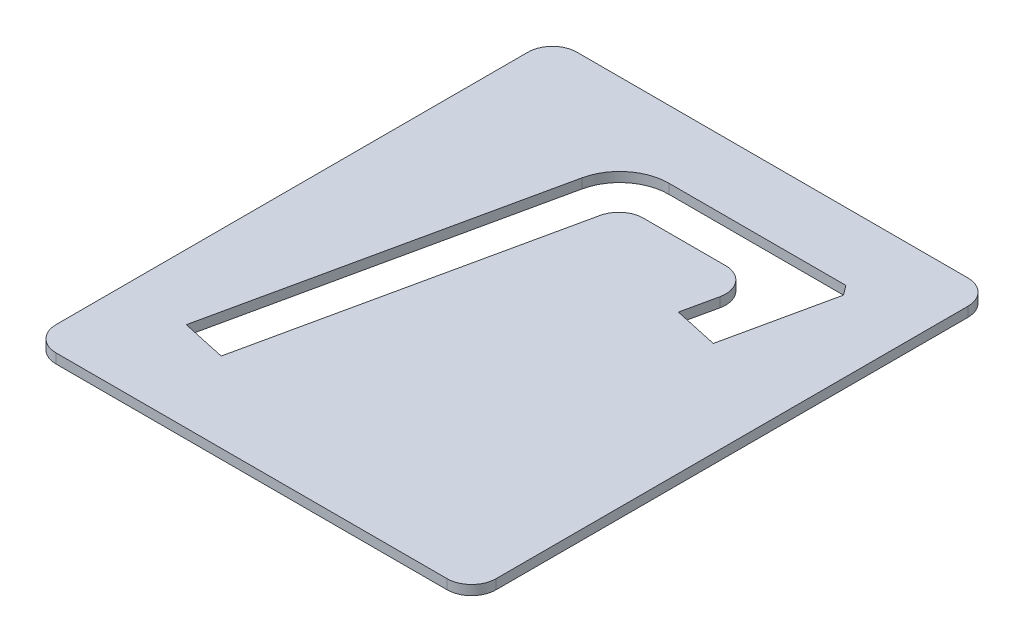
ISO-10303-21;
HEADER;
FILE_DESCRIPTION(('STEP AP214'),'2;1');
FILE_NAME('part.step','',(''),(''),'','','');
FILE_SCHEMA(('AUTOMOTIVE_DESIGN { 1 0 10303 214 1 1 1 1 }'));
ENDSEC;
DATA;
#1=APPLICATION_CONTEXT('core data for automotive mechanical design processes');
#2=APPLICATION_PROTOCOL_DEFINITION('international standard','automotive_design',2000,#1);
#3=PRODUCT_CONTEXT('',#1,'mechanical');
#4=PRODUCT('Part','Part','',(#3));
#5=PRODUCT_RELATED_PRODUCT_CATEGORY('part','',(#4));
#6=PRODUCT_DEFINITION_FORMATION('','',#4);
#7=PRODUCT_DEFINITION_CONTEXT('part definition',#1,'design');
#8=PRODUCT_DEFINITION('design','',#6,#7);
#9=PRODUCT_DEFINITION_SHAPE('','',#8);
#10=(LENGTH_UNIT() NAMED_UNIT(*) SI_UNIT(.MILLI.,.METRE.));
#11=(NAMED_UNIT(*) PLANE_ANGLE_UNIT() SI_UNIT($,.RADIAN.));
#12=(NAMED_UNIT(*) SI_UNIT($,.STERADIAN.) SOLID_ANGLE_UNIT());
#13=UNCERTAINTY_MEASURE_WITH_UNIT(LENGTH_MEASURE(1.E-05),#10,'distance_accuracy_value','');
#14=(GEOMETRIC_REPRESENTATION_CONTEXT(3) GLOBAL_UNCERTAINTY_ASSIGNED_CONTEXT((#13)) GLOBAL_UNIT_ASSIGNED_CONTEXT((#10,
#11,#12)) REPRESENTATION_CONTEXT('',''));
#15=CARTESIAN_POINT('',(0.,0.,0.));
#16=DIRECTION('',(0.,0.,1.));
#17=DIRECTION('',(1.,0.,0.));
#18=AXIS2_PLACEMENT_3D('',#15,#16,#17);
#19=CARTESIAN_POINT('',(-12.14314758519,-14.48400066,1.478172004546));
#20=DIRECTION('',(0.,1.,0.));
#21=DIRECTION('',(0.,0.,1.));
#22=AXIS2_PLACEMENT_3D('',#19,#20,#21);
#23=PLANE('',#22);
#24=DIRECTION('',(0.212429649393078,0.,-0.977176362822359));
#25=VECTOR('',#24,1.);
#26=CARTESIAN_POINT('',(-12.01390357573,-14.48400066,1.39915469259));
#27=LINE('',#26,#25);
#28=CARTESIAN_POINT('',(-12.0139035757299,-14.48400066,1.39915469258943));
#29=VERTEX_POINT('',#28);
#30=CARTESIAN_POINT('',(-11.989866506041,-14.48400066,1.28858417479478));
#31=VERTEX_POINT('',#30);
#32=EDGE_CURVE('E220',#29,#31,#27,.T.);
#33=ORIENTED_EDGE('',*,*,#32,.T.);
#34=DIRECTION('',(-0.598473967642059,0.,-0.801142253320078));
#35=VECTOR('',#34,1.);
#36=CARTESIAN_POINT('',(-11.98986650604,-14.48400066,1.288584174795));
#37=LINE('',#36,#35);
#38=CARTESIAN_POINT('',(-11.9973603129465,-14.48400066,1.2785526518309));
#39=VERTEX_POINT('',#38);
#40=EDGE_CURVE('E264',#31,#39,#37,.T.);
#41=ORIENTED_EDGE('',*,*,#40,.T.);
#42=DIRECTION('',(-1.,0.,0.));
#43=VECTOR('',#42,1.);
#44=CARTESIAN_POINT('',(-11.99736031295,-14.48400066,1.278552651833));
#45=LINE('',#44,#43);
#46=CARTESIAN_POINT('',(-12.18054455317,-14.48400066,1.278552651833));
#47=VERTEX_POINT('',#46);
#48=EDGE_CURVE('E258',#39,#47,#45,.T.);
#49=ORIENTED_EDGE('',*,*,#48,.T.);
#50=CARTESIAN_POINT('',(-12.18054455317,-14.48400066,1.329352651833));
#51=DIRECTION('',(0.,1.,0.));
#52=DIRECTION('',(0.,0.,1.));
#53=AXIS2_PLACEMENT_3D('',#50,#51,#52);
#54=CIRCLE('',#53,0.0508);
#55=CARTESIAN_POINT('',(-12.2301851124007,-14.48400066,1.31856122564392));
#56=VERTEX_POINT('',#55);
#57=EDGE_CURVE('E221',#47,#56,#54,.T.);
#58=ORIENTED_EDGE('',*,*,#57,.T.);
#59=DIRECTION('',(-0.212429649393078,0.,0.977176362822359));
#60=VECTOR('',#59,1.);
#61=CARTESIAN_POINT('',(-12.2301851124,-14.48400066,1.318561225644));
#62=LINE('',#61,#60);
#63=CARTESIAN_POINT('',(-12.3033152809703,-14.48400066,1.65495999267294));
#64=VERTEX_POINT('',#63);
#65=EDGE_CURVE('E269',#56,#64,#62,.T.);
#66=ORIENTED_EDGE('',*,*,#65,.T.);
#67=DIRECTION('',(0.977176362822359,0.,0.212429649393078));
#68=VECTOR('',#67,1.);
#69=CARTESIAN_POINT('',(-12.30331528097,-14.48400066,1.654959992673));
#70=LINE('',#69,#68);
#71=CARTESIAN_POINT('',(-12.2571702764999,-14.48400066,1.6649915156345));
#72=VERTEX_POINT('',#71);
#73=EDGE_CURVE('E275',#64,#72,#70,.T.);
#74=ORIENTED_EDGE('',*,*,#73,.T.);
#75=DIRECTION('',(0.212429649393078,0.,-0.977176362822359));
#76=VECTOR('',#75,1.);
#77=CARTESIAN_POINT('',(-12.2571702765,-14.48400066,1.664991515635));
#78=LINE('',#77,#76);
#79=CARTESIAN_POINT('',(-12.1871851567016,-14.48400066,1.34305997259639));
#80=VERTEX_POINT('',#79);
#81=EDGE_CURVE('E281',#72,#80,#78,.T.);
#82=ORIENTED_EDGE('',*,*,#81,.T.);
#83=CARTESIAN_POINT('',(-12.16236487708,-14.48400066,1.348455685692));
#84=DIRECTION('',(0.,1.,0.));
#85=DIRECTION('',(0.,0.,1.));
#86=AXIS2_PLACEMENT_3D('',#83,#84,#85);
#87=CIRCLE('',#86,0.0254);
#88=CARTESIAN_POINT('',(-12.16236487708,-14.48400066,1.323055685692));
#89=VERTEX_POINT('',#88);
#90=EDGE_CURVE('E226',#89,#80,#87,.T.);
#91=ORIENTED_EDGE('',*,*,#90,.F.);
#92=DIRECTION('',(1.,0.,0.));
#93=VECTOR('',#92,1.);
#94=CARTESIAN_POINT('',(-12.16236487708,-14.48400066,1.323055685692));
#95=LINE('',#94,#93);
#96=CARTESIAN_POINT('',(-12.07720108336,-14.48400066,1.323055685692));
#97=VERTEX_POINT('',#96);
#98=EDGE_CURVE('E229',#89,#97,#95,.T.);
#99=ORIENTED_EDGE('',*,*,#98,.T.);
#100=CARTESIAN_POINT('',(-12.07720108336,-14.48400066,1.348455685692));
#101=DIRECTION('',(0.,1.,0.));
#102=DIRECTION('',(0.,0.,1.));
#103=AXIS2_PLACEMENT_3D('',#100,#101,#102);
#104=CIRCLE('',#103,0.0254);
#105=CARTESIAN_POINT('',(-12.0523808037422,-14.48400066,1.35385139878629));
#106=VERTEX_POINT('',#105);
#107=EDGE_CURVE('E230',#106,#97,#104,.T.);
#108=ORIENTED_EDGE('',*,*,#107,.F.);
#109=DIRECTION('',(-0.212429649393078,0.,0.977176362822359));
#110=VECTOR('',#109,1.);
#111=CARTESIAN_POINT('',(-12.05238080374,-14.48400066,1.353851398786));
#112=LINE('',#111,#110);
#113=CARTESIAN_POINT('',(-12.0600485802007,-14.48400066,1.38912316962684));
#114=VERTEX_POINT('',#113);
#115=EDGE_CURVE('E233',#106,#114,#112,.T.);
#116=ORIENTED_EDGE('',*,*,#115,.T.);
#117=DIRECTION('',(0.977176362822359,0.,0.212429649393078));
#118=VECTOR('',#117,1.);
#119=CARTESIAN_POINT('',(-12.0600485802,-14.48400066,1.389123169627));
#120=LINE('',#119,#118);
#121=EDGE_CURVE('E248',#114,#29,#120,.T.);
#122=ORIENTED_EDGE('',*,*,#121,.T.);
#123=EDGE_LOOP('',(#33,#41,#49,#58,#66,#74,#82,#91,#99,#108,#116,#122));
#124=FACE_BOUND('',#123,.T.);
#125=DIRECTION('',(1.,0.,0.));
#126=VECTOR('',#125,1.);
#127=CARTESIAN_POINT('',(-12.34536886475,-14.48400066,1.747601269081));
#128=LINE('',#127,#126);
#129=CARTESIAN_POINT('',(-12.34536886475,-14.48400066,1.747601269081));
#130=VERTEX_POINT('',#129);
#131=CARTESIAN_POINT('',(-11.94092630563,-14.48400066,1.747601269081));
#132=VERTEX_POINT('',#131);
#133=EDGE_CURVE('E153',#130,#132,#128,.T.);
#134=ORIENTED_EDGE('',*,*,#133,.F.);
#135=CARTESIAN_POINT('',(-12.34536886475,-14.48400066,1.722201269081));
#136=DIRECTION('',(0.,1.,0.));
#137=DIRECTION('',(0.,0.,1.));
#138=AXIS2_PLACEMENT_3D('',#135,#136,#137);
#139=CIRCLE('',#138,0.0254);
#140=CARTESIAN_POINT('',(-12.37076886475,-14.48400066,1.722201269081));
#141=VERTEX_POINT('',#140);
#142=EDGE_CURVE('E174',#141,#130,#139,.T.);
#143=ORIENTED_EDGE('',*,*,#142,.F.);
#144=DIRECTION('',(0.,0.,1.));
#145=VECTOR('',#144,1.);
#146=CARTESIAN_POINT('',(-12.37076886475,-14.48400066,1.234142740011));
#147=LINE('',#146,#145);
#148=CARTESIAN_POINT('',(-12.37076886475,-14.48400066,1.234142740011));
#149=VERTEX_POINT('',#148);
#150=EDGE_CURVE('E180',#149,#141,#147,.T.);
#151=ORIENTED_EDGE('',*,*,#150,.F.);
#152=CARTESIAN_POINT('',(-12.34536886475,-14.48400066,1.234142740011));
#153=DIRECTION('',(0.,1.,0.));
#154=DIRECTION('',(0.,0.,1.));
#155=AXIS2_PLACEMENT_3D('',#152,#153,#154);
#156=CIRCLE('',#155,0.0254);
#157=CARTESIAN_POINT('',(-12.34536886475,-14.48400066,1.208742740011));
#158=VERTEX_POINT('',#157);
#159=EDGE_CURVE('E235',#158,#149,#156,.T.);
#160=ORIENTED_EDGE('',*,*,#159,.F.);
#161=DIRECTION('',(-1.,0.,0.));
#162=VECTOR('',#161,1.);
#163=CARTESIAN_POINT('',(-11.94092630563,-14.48400066,1.208742740011));
#164=LINE('',#163,#162);
#165=CARTESIAN_POINT('',(-11.94092630563,-14.48400066,1.208742740011));
#166=VERTEX_POINT('',#165);
#167=EDGE_CURVE('E185',#166,#158,#164,.T.);
#168=ORIENTED_EDGE('',*,*,#167,.F.);
#169=CARTESIAN_POINT('',(-11.94092630563,-14.48400066,1.234142740011));
#170=DIRECTION('',(0.,1.,0.));
#171=DIRECTION('',(0.,0.,1.));
#172=AXIS2_PLACEMENT_3D('',#169,#170,#171);
#173=CIRCLE('',#172,0.0254);
#174=CARTESIAN_POINT('',(-11.91552630563,-14.48400066,1.234142740011));
#175=VERTEX_POINT('',#174);
#176=EDGE_CURVE('E237',#175,#166,#173,.T.);
#177=ORIENTED_EDGE('',*,*,#176,.F.);
#178=DIRECTION('',(0.,0.,-1.));
#179=VECTOR('',#178,1.);
#180=CARTESIAN_POINT('',(-11.91552630563,-14.48400066,1.722201269081));
#181=LINE('',#180,#179);
#182=CARTESIAN_POINT('',(-11.91552630563,-14.48400066,1.722201269081));
#183=VERTEX_POINT('',#182);
#184=EDGE_CURVE('E156',#183,#175,#181,.T.);
#185=ORIENTED_EDGE('',*,*,#184,.F.);
#186=CARTESIAN_POINT('',(-11.94092630563,-14.48400066,1.722201269081));
#187=DIRECTION('',(0.,1.,0.));
#188=DIRECTION('',(0.,0.,1.));
#189=AXIS2_PLACEMENT_3D('',#186,#187,#188);
#190=CIRCLE('',#189,0.0254);
#191=EDGE_CURVE('E20',#132,#183,#190,.T.);
#192=ORIENTED_EDGE('',*,*,#191,.F.);
#193=EDGE_LOOP('',(#134,#143,#151,#160,#168,#177,#185,#192));
#194=FACE_BOUND('',#193,.T.);
#195=ADVANCED_FACE('F17',(#124,#194),#23,.F.);
#196=CARTESIAN_POINT('',(-11.94092630563,-14.48400066,1.722201269081));
#197=DIRECTION('',(0.,1.,0.));
#198=DIRECTION('',(0.,0.,1.));
#199=AXIS2_PLACEMENT_3D('',#196,#197,#198);
#200=CYLINDRICAL_SURFACE('',#199,0.0254);
#201=CARTESIAN_POINT('',(-11.94092630563,-14.47400066,1.722201269081));
#202=DIRECTION('',(0.,1.,0.));
#203=DIRECTION('',(0.,0.,1.));
#204=AXIS2_PLACEMENT_3D('',#201,#202,#203);
#205=CIRCLE('',#204,0.0254);
#206=CARTESIAN_POINT('',(-11.94092630563,-14.47400066,1.747601269081));
#207=VERTEX_POINT('',#206);
#208=CARTESIAN_POINT('',(-11.91552630563,-14.47400066,1.722201269081));
#209=VERTEX_POINT('',#208);
#210=EDGE_CURVE('E163',#207,#209,#205,.T.);
#211=ORIENTED_EDGE('',*,*,#210,.F.);
#212=DIRECTION('',(0.,1.,0.));
#213=VECTOR('',#212,1.);
#214=CARTESIAN_POINT('',(-11.94092630563,-14.48400066,1.747601269081));
#215=LINE('',#214,#213);
#216=EDGE_CURVE('E160',#132,#207,#215,.T.);
#217=ORIENTED_EDGE('',*,*,#216,.F.);
#218=ORIENTED_EDGE('',*,*,#191,.T.);
#219=DIRECTION('',(0.,1.,0.));
#220=VECTOR('',#219,1.);
#221=CARTESIAN_POINT('',(-11.91552630563,-14.48400066,1.722201269081));
#222=LINE('',#221,#220);
#223=EDGE_CURVE('E191',#209,#183,#222,.F.);
#224=ORIENTED_EDGE('',*,*,#223,.F.);
#225=EDGE_LOOP('',(#211,#217,#218,#224));
#226=FACE_BOUND('',#225,.T.);
#227=ADVANCED_FACE('F161',(#226),#200,.T.);
#228=CARTESIAN_POINT('',(-11.91552630563,-14.48400066,1.722201269081));
#229=DIRECTION('',(1.,0.,0.));
#230=DIRECTION('',(0.,0.,-1.));
#231=AXIS2_PLACEMENT_3D('',#228,#229,#230);
#232=PLANE('',#231);
#233=DIRECTION('',(0.,0.,1.));
#234=VECTOR('',#233,1.);
#235=CARTESIAN_POINT('',(-11.91552630563,-14.47400066,1.478172004546));
#236=LINE('',#235,#234);
#237=CARTESIAN_POINT('',(-11.91552630563,-14.47400066,1.234142740011));
#238=VERTEX_POINT('',#237);
#239=EDGE_CURVE('E218',#209,#238,#236,.F.);
#240=ORIENTED_EDGE('',*,*,#239,.F.);
#241=ORIENTED_EDGE('',*,*,#223,.T.);
#242=ORIENTED_EDGE('',*,*,#184,.T.);
#243=DIRECTION('',(0.,1.,0.));
#244=VECTOR('',#243,1.);
#245=CARTESIAN_POINT('',(-11.91552630563,-14.48400066,1.234142740011));
#246=LINE('',#245,#244);
#247=EDGE_CURVE('E189',#238,#175,#246,.F.);
#248=ORIENTED_EDGE('',*,*,#247,.F.);
#249=EDGE_LOOP('',(#240,#241,#242,#248));
#250=FACE_BOUND('',#249,.T.);
#251=ADVANCED_FACE('F574',(#250),#232,.T.);
#252=CARTESIAN_POINT('',(-11.94092630563,-14.48400066,1.234142740011));
#253=DIRECTION('',(0.,1.,0.));
#254=DIRECTION('',(0.,0.,1.));
#255=AXIS2_PLACEMENT_3D('',#252,#253,#254);
#256=CYLINDRICAL_SURFACE('',#255,0.0254);
#257=CARTESIAN_POINT('',(-11.94092630563,-14.47400066,1.234142740011));
#258=DIRECTION('',(0.,1.,0.));
#259=DIRECTION('',(0.,0.,1.));
#260=AXIS2_PLACEMENT_3D('',#257,#258,#259);
#261=CIRCLE('',#260,0.0254);
#262=CARTESIAN_POINT('',(-11.94092630563,-14.47400066,1.208742740011));
#263=VERTEX_POINT('',#262);
#264=EDGE_CURVE('E215',#238,#263,#261,.T.);
#265=ORIENTED_EDGE('',*,*,#264,.F.);
#266=ORIENTED_EDGE('',*,*,#247,.T.);
#267=ORIENTED_EDGE('',*,*,#176,.T.);
#268=DIRECTION('',(0.,1.,0.));
#269=VECTOR('',#268,1.);
#270=CARTESIAN_POINT('',(-11.94092630563,-14.48400066,1.208742740011));
#271=LINE('',#270,#269);
#272=EDGE_CURVE('E188',#263,#166,#271,.F.);
#273=ORIENTED_EDGE('',*,*,#272,.F.);
#274=EDGE_LOOP('',(#265,#266,#267,#273));
#275=FACE_BOUND('',#274,.T.);
#276=ADVANCED_FACE('F321',(#275),#256,.T.);
#277=CARTESIAN_POINT('',(-11.94092630563,-14.48400066,1.208742740011));
#278=DIRECTION('',(0.,0.,-1.));
#279=DIRECTION('',(-1.,0.,0.));
#280=AXIS2_PLACEMENT_3D('',#277,#278,#279);
#281=PLANE('',#280);
#282=DIRECTION('',(1.,0.,0.));
#283=VECTOR('',#282,1.);
#284=CARTESIAN_POINT('',(-12.14314758519,-14.47400066,1.208742740011));
#285=LINE('',#284,#283);
#286=CARTESIAN_POINT('',(-12.34536886475,-14.47400066,1.208742740011));
#287=VERTEX_POINT('',#286);
#288=EDGE_CURVE('E214',#263,#287,#285,.F.);
#289=ORIENTED_EDGE('',*,*,#288,.F.);
#290=ORIENTED_EDGE('',*,*,#272,.T.);
#291=ORIENTED_EDGE('',*,*,#167,.T.);
#292=DIRECTION('',(0.,1.,0.));
#293=VECTOR('',#292,1.);
#294=CARTESIAN_POINT('',(-12.34536886475,-14.48400066,1.208742740011));
#295=LINE('',#294,#293);
#296=EDGE_CURVE('E184',#287,#158,#295,.F.);
#297=ORIENTED_EDGE('',*,*,#296,.F.);
#298=EDGE_LOOP('',(#289,#290,#291,#297));
#299=FACE_BOUND('',#298,.T.);
#300=ADVANCED_FACE('F318',(#299),#281,.T.);
#301=CARTESIAN_POINT('',(-12.34536886475,-14.48400066,1.234142740011));
#302=DIRECTION('',(0.,1.,0.));
#303=DIRECTION('',(0.,0.,1.));
#304=AXIS2_PLACEMENT_3D('',#301,#302,#303);
#305=CYLINDRICAL_SURFACE('',#304,0.0254);
#306=CARTESIAN_POINT('',(-12.34536886475,-14.47400066,1.234142740011));
#307=DIRECTION('',(0.,1.,0.));
#308=DIRECTION('',(0.,0.,1.));
#309=AXIS2_PLACEMENT_3D('',#306,#307,#308);
#310=CIRCLE('',#309,0.0254);
#311=CARTESIAN_POINT('',(-12.37076886475,-14.47400066,1.234142740011));
#312=VERTEX_POINT('',#311);
#313=EDGE_CURVE('E211',#287,#312,#310,.T.);
#314=ORIENTED_EDGE('',*,*,#313,.F.);
#315=ORIENTED_EDGE('',*,*,#296,.T.);
#316=ORIENTED_EDGE('',*,*,#159,.T.);
#317=DIRECTION('',(0.,1.,0.));
#318=VECTOR('',#317,1.);
#319=CARTESIAN_POINT('',(-12.37076886475,-14.48400066,1.234142740011));
#320=LINE('',#319,#318);
#321=EDGE_CURVE('E183',#312,#149,#320,.F.);
#322=ORIENTED_EDGE('',*,*,#321,.F.);
#323=EDGE_LOOP('',(#314,#315,#316,#322));
#324=FACE_BOUND('',#323,.T.);
#325=ADVANCED_FACE('F416',(#324),#305,.T.);
#326=CARTESIAN_POINT('',(-12.37076886475,-14.48400066,1.234142740011));
#327=DIRECTION('',(-1.,0.,0.));
#328=DIRECTION('',(0.,0.,1.));
#329=AXIS2_PLACEMENT_3D('',#326,#327,#328);
#330=PLANE('',#329);
#331=DIRECTION('',(0.,0.,1.));
#332=VECTOR('',#331,1.);
#333=CARTESIAN_POINT('',(-12.37076886475,-14.47400066,1.478172004546));
#334=LINE('',#333,#332);
#335=CARTESIAN_POINT('',(-12.37076886475,-14.47400066,1.722201269081));
#336=VERTEX_POINT('',#335);
#337=EDGE_CURVE('E210',#312,#336,#334,.T.);
#338=ORIENTED_EDGE('',*,*,#337,.F.);
#339=ORIENTED_EDGE('',*,*,#321,.T.);
#340=ORIENTED_EDGE('',*,*,#150,.T.);
#341=DIRECTION('',(0.,1.,0.));
#342=VECTOR('',#341,1.);
#343=CARTESIAN_POINT('',(-12.37076886475,-14.48400066,1.722201269081));
#344=LINE('',#343,#342);
#345=EDGE_CURVE('E171',#336,#141,#344,.F.);
#346=ORIENTED_EDGE('',*,*,#345,.F.);
#347=EDGE_LOOP('',(#338,#339,#340,#346));
#348=FACE_BOUND('',#347,.T.);
#349=ADVANCED_FACE('F412',(#348),#330,.T.);
#350=CARTESIAN_POINT('',(-12.34536886475,-14.48400066,1.722201269081));
#351=DIRECTION('',(0.,1.,0.));
#352=DIRECTION('',(0.,0.,1.));
#353=AXIS2_PLACEMENT_3D('',#350,#351,#352);
#354=CYLINDRICAL_SURFACE('',#353,0.0254);
#355=CARTESIAN_POINT('',(-12.34536886475,-14.47400066,1.722201269081));
#356=DIRECTION('',(0.,1.,0.));
#357=DIRECTION('',(0.,0.,1.));
#358=AXIS2_PLACEMENT_3D('',#355,#356,#357);
#359=CIRCLE('',#358,0.0254);
#360=CARTESIAN_POINT('',(-12.34536886475,-14.47400066,1.747601269081));
#361=VERTEX_POINT('',#360);
#362=EDGE_CURVE('E206',#336,#361,#359,.T.);
#363=ORIENTED_EDGE('',*,*,#362,.F.);
#364=ORIENTED_EDGE('',*,*,#345,.T.);
#365=ORIENTED_EDGE('',*,*,#142,.T.);
#366=DIRECTION('',(0.,1.,0.));
#367=VECTOR('',#366,1.);
#368=CARTESIAN_POINT('',(-12.34536886475,-14.48400066,1.747601269081));
#369=LINE('',#368,#367);
#370=EDGE_CURVE('E167',#361,#130,#369,.F.);
#371=ORIENTED_EDGE('',*,*,#370,.F.);
#372=EDGE_LOOP('',(#363,#364,#365,#371));
#373=FACE_BOUND('',#372,.T.);
#374=ADVANCED_FACE('F414',(#373),#354,.T.);
#375=CARTESIAN_POINT('',(-12.34536886475,-14.48400066,1.747601269081));
#376=DIRECTION('',(0.,0.,1.));
#377=DIRECTION('',(1.,0.,0.));
#378=AXIS2_PLACEMENT_3D('',#375,#376,#377);
#379=PLANE('',#378);
#380=DIRECTION('',(1.,0.,0.));
#381=VECTOR('',#380,1.);
#382=CARTESIAN_POINT('',(-12.14314758519,-14.47400066,1.747601269081));
#383=LINE('',#382,#381);
#384=EDGE_CURVE('E209',#361,#207,#383,.T.);
#385=ORIENTED_EDGE('',*,*,#384,.F.);
#386=ORIENTED_EDGE('',*,*,#370,.T.);
#387=ORIENTED_EDGE('',*,*,#133,.T.);
#388=ORIENTED_EDGE('',*,*,#216,.T.);
#389=EDGE_LOOP('',(#385,#386,#387,#388));
#390=FACE_BOUND('',#389,.T.);
#391=ADVANCED_FACE('F170',(#390),#379,.T.);
#392=CARTESIAN_POINT('',(-12.0600485802,-14.48400066,1.389123169627));
#393=DIRECTION('',(-0.212429649393078,0.,0.977176362822359));
#394=DIRECTION('',(0.977176362822359,0.,0.212429649393078));
#395=AXIS2_PLACEMENT_3D('',#392,#393,#394);
#396=PLANE('',#395);
#397=DIRECTION('',(0.,1.,0.));
#398=VECTOR('',#397,1.);
#399=CARTESIAN_POINT('',(-12.0600485802011,-14.48400066,1.38912316962676));
#400=LINE('',#399,#398);
#401=CARTESIAN_POINT('',(-12.0600485802004,-14.47400066,1.38912316962692));
#402=VERTEX_POINT('',#401);
#403=EDGE_CURVE('E250',#114,#402,#400,.T.);
#404=ORIENTED_EDGE('',*,*,#403,.T.);
#405=DIRECTION('',(-0.977176362814492,0.,-0.212429649429265));
#406=VECTOR('',#405,1.);
#407=CARTESIAN_POINT('',(-12.01390357573,-14.47400066,1.39915469259));
#408=LINE('',#407,#406);
#409=CARTESIAN_POINT('',(-12.01390357573,-14.47400066,1.39915469259));
#410=VERTEX_POINT('',#409);
#411=EDGE_CURVE('E301',#410,#402,#408,.T.);
#412=ORIENTED_EDGE('',*,*,#411,.F.);
#413=DIRECTION('',(0.,1.,0.));
#414=VECTOR('',#413,1.);
#415=CARTESIAN_POINT('',(-12.01390357573,-14.48400066,1.39915469259));
#416=LINE('',#415,#414);
#417=EDGE_CURVE('E255',#410,#29,#416,.F.);
#418=ORIENTED_EDGE('',*,*,#417,.T.);
#419=ORIENTED_EDGE('',*,*,#121,.F.);
#420=EDGE_LOOP('',(#404,#412,#418,#419));
#421=FACE_BOUND('',#420,.T.);
#422=ADVANCED_FACE('F364',(#421),#396,.F.);
#423=CARTESIAN_POINT('',(-12.05238080374,-14.48400066,1.353851398786));
#424=DIRECTION('',(-0.977176362822359,0.,-0.212429649393078));
#425=DIRECTION('',(-0.212429649393078,0.,0.977176362822359));
#426=AXIS2_PLACEMENT_3D('',#423,#424,#425);
#427=PLANE('',#426);
#428=DIRECTION('',(0.,1.,0.));
#429=VECTOR('',#428,1.);
#430=CARTESIAN_POINT('',(-12.052380803744,-14.48400066,1.35385139878513));
#431=LINE('',#430,#429);
#432=CARTESIAN_POINT('',(-12.0523808037421,-14.47400066,1.35385139878591));
#433=VERTEX_POINT('',#432);
#434=EDGE_CURVE('E232',#433,#106,#431,.F.);
#435=ORIENTED_EDGE('',*,*,#434,.F.);
#436=DIRECTION('',(0.212429649363099,0.,-0.977176362828876));
#437=VECTOR('',#436,1.);
#438=CARTESIAN_POINT('',(-12.0600485802,-14.47400066,1.389123169627));
#439=LINE('',#438,#437);
#440=EDGE_CURVE('E205',#402,#433,#439,.T.);
#441=ORIENTED_EDGE('',*,*,#440,.F.);
#442=ORIENTED_EDGE('',*,*,#403,.F.);
#443=ORIENTED_EDGE('',*,*,#115,.F.);
#444=EDGE_LOOP('',(#435,#441,#442,#443));
#445=FACE_BOUND('',#444,.T.);
#446=ADVANCED_FACE('F360',(#445),#427,.F.);
#447=CARTESIAN_POINT('',(-12.07720108336,-14.48400066,1.348455685692));
#448=DIRECTION('',(0.,1.,0.));
#449=DIRECTION('',(0.,0.,1.));
#450=AXIS2_PLACEMENT_3D('',#447,#448,#449);
#451=CYLINDRICAL_SURFACE('',#450,0.0254);
#452=CARTESIAN_POINT('',(-12.07720108336,-14.47400066,1.348455685692));
#453=DIRECTION('',(0.,1.,0.));
#454=DIRECTION('',(0.,0.,1.));
#455=AXIS2_PLACEMENT_3D('',#452,#453,#454);
#456=CIRCLE('',#455,0.0254);
#457=CARTESIAN_POINT('',(-12.07720108336,-14.47400066,1.323055685692));
#458=VERTEX_POINT('',#457);
#459=EDGE_CURVE('E202',#433,#458,#456,.T.);
#460=ORIENTED_EDGE('',*,*,#459,.F.);
#461=ORIENTED_EDGE('',*,*,#434,.T.);
#462=ORIENTED_EDGE('',*,*,#107,.T.);
#463=DIRECTION('',(0.,1.,0.));
#464=VECTOR('',#463,1.);
#465=CARTESIAN_POINT('',(-12.07720108336,-14.48400066,1.323055685692));
#466=LINE('',#465,#464);
#467=EDGE_CURVE('E288',#97,#458,#466,.T.);
#468=ORIENTED_EDGE('',*,*,#467,.T.);
#469=EDGE_LOOP('',(#460,#461,#462,#468));
#470=FACE_BOUND('',#469,.T.);
#471=ADVANCED_FACE('F357',(#470),#451,.T.);
#472=CARTESIAN_POINT('',(-12.16236487708,-14.48400066,1.323055685692));
#473=DIRECTION('',(0.,0.,1.));
#474=DIRECTION('',(1.,0.,0.));
#475=AXIS2_PLACEMENT_3D('',#472,#473,#474);
#476=PLANE('',#475);
#477=DIRECTION('',(0.,1.,0.));
#478=VECTOR('',#477,1.);
#479=CARTESIAN_POINT('',(-12.16236487708,-14.48400066,1.323055685692));
#480=LINE('',#479,#478);
#481=CARTESIAN_POINT('',(-12.16236487708,-14.47400066,1.323055685692));
#482=VERTEX_POINT('',#481);
#483=EDGE_CURVE('E228',#482,#89,#480,.F.);
#484=ORIENTED_EDGE('',*,*,#483,.F.);
#485=DIRECTION('',(1.,0.,0.));
#486=VECTOR('',#485,1.);
#487=CARTESIAN_POINT('',(-12.14314758519,-14.47400066,1.323055685692));
#488=LINE('',#487,#486);
#489=EDGE_CURVE('E201',#458,#482,#488,.F.);
#490=ORIENTED_EDGE('',*,*,#489,.F.);
#491=ORIENTED_EDGE('',*,*,#467,.F.);
#492=ORIENTED_EDGE('',*,*,#98,.F.);
#493=EDGE_LOOP('',(#484,#490,#491,#492));
#494=FACE_BOUND('',#493,.T.);
#495=ADVANCED_FACE('F396',(#494),#476,.F.);
#496=CARTESIAN_POINT('',(-12.16236487708,-14.48400066,1.348455685692));
#497=DIRECTION('',(0.,1.,0.));
#498=DIRECTION('',(0.,0.,1.));
#499=AXIS2_PLACEMENT_3D('',#496,#497,#498);
#500=CYLINDRICAL_SURFACE('',#499,0.0254);
#501=CARTESIAN_POINT('',(-12.16236487708,-14.47400066,1.348455685692));
#502=DIRECTION('',(0.,1.,0.));
#503=DIRECTION('',(0.,0.,1.));
#504=AXIS2_PLACEMENT_3D('',#501,#502,#503);
#505=CIRCLE('',#504,0.0254);
#506=CARTESIAN_POINT('',(-12.1871851567008,-14.47400066,1.3430599725965));
#507=VERTEX_POINT('',#506);
#508=EDGE_CURVE('E197',#482,#507,#505,.T.);
#509=ORIENTED_EDGE('',*,*,#508,.F.);
#510=ORIENTED_EDGE('',*,*,#483,.T.);
#511=ORIENTED_EDGE('',*,*,#90,.T.);
#512=DIRECTION('',(0.,1.,0.));
#513=VECTOR('',#512,1.);
#514=CARTESIAN_POINT('',(-12.1871851567017,-14.48400066,1.34305997259664));
#515=LINE('',#514,#513);
#516=EDGE_CURVE('E284',#80,#507,#515,.T.);
#517=ORIENTED_EDGE('',*,*,#516,.T.);
#518=EDGE_LOOP('',(#509,#510,#511,#517));
#519=FACE_BOUND('',#518,.T.);
#520=ADVANCED_FACE('F398',(#519),#500,.T.);
#521=CARTESIAN_POINT('',(-12.2571702765,-14.48400066,1.664991515635));
#522=DIRECTION('',(0.977176362822359,0.,0.212429649393078));
#523=DIRECTION('',(0.212429649393078,0.,-0.977176362822359));
#524=AXIS2_PLACEMENT_3D('',#521,#522,#523);
#525=PLANE('',#524);
#526=DIRECTION('',(0.,1.,0.));
#527=VECTOR('',#526,1.);
#528=CARTESIAN_POINT('',(-12.2571702764998,-14.48400066,1.66499151563425));
#529=LINE('',#528,#527);
#530=CARTESIAN_POINT('',(-12.2571702764999,-14.47400066,1.66499151563475));
#531=VERTEX_POINT('',#530);
#532=EDGE_CURVE('E278',#72,#531,#529,.T.);
#533=ORIENTED_EDGE('',*,*,#532,.T.);
#534=DIRECTION('',(-0.212429649398172,0.,0.977176362821251));
#535=VECTOR('',#534,1.);
#536=CARTESIAN_POINT('',(-12.1871851567,-14.47400066,1.343059972597));
#537=LINE('',#536,#535);
#538=EDGE_CURVE('E200',#507,#531,#537,.T.);
#539=ORIENTED_EDGE('',*,*,#538,.F.);
#540=ORIENTED_EDGE('',*,*,#516,.F.);
#541=ORIENTED_EDGE('',*,*,#81,.F.);
#542=EDGE_LOOP('',(#533,#539,#540,#541));
#543=FACE_BOUND('',#542,.T.);
#544=ADVANCED_FACE('F391',(#543),#525,.F.);
#545=CARTESIAN_POINT('',(-12.30331528097,-14.48400066,1.654959992673));
#546=DIRECTION('',(-0.212429649393078,0.,0.977176362822359));
#547=DIRECTION('',(0.977176362822359,0.,0.212429649393078));
#548=AXIS2_PLACEMENT_3D('',#545,#546,#547);
#549=PLANE('',#548);
#550=DIRECTION('',(0.,1.,0.));
#551=VECTOR('',#550,1.);
#552=CARTESIAN_POINT('',(-12.3033152809704,-14.48400066,1.65495999267291));
#553=LINE('',#552,#551);
#554=CARTESIAN_POINT('',(-12.3033152809701,-14.47400066,1.65495999267297));
#555=VERTEX_POINT('',#554);
#556=EDGE_CURVE('E272',#64,#555,#553,.T.);
#557=ORIENTED_EDGE('',*,*,#556,.T.);
#558=DIRECTION('',(-0.977176362818886,0.,-0.212429649409051));
#559=VECTOR('',#558,1.);
#560=CARTESIAN_POINT('',(-12.2571702765,-14.47400066,1.664991515635));
#561=LINE('',#560,#559);
#562=EDGE_CURVE('E342',#531,#555,#561,.T.);
#563=ORIENTED_EDGE('',*,*,#562,.F.);
#564=ORIENTED_EDGE('',*,*,#532,.F.);
#565=ORIENTED_EDGE('',*,*,#73,.F.);
#566=EDGE_LOOP('',(#557,#563,#564,#565));
#567=FACE_BOUND('',#566,.T.);
#568=ADVANCED_FACE('F387',(#567),#549,.F.);
#569=CARTESIAN_POINT('',(-12.2301851124,-14.48400066,1.318561225644));
#570=DIRECTION('',(-0.977176362822359,0.,-0.212429649393078));
#571=DIRECTION('',(-0.212429649393078,0.,0.977176362822359));
#572=AXIS2_PLACEMENT_3D('',#569,#570,#571);
#573=PLANE('',#572);
#574=DIRECTION('',(0.,1.,0.));
#575=VECTOR('',#574,1.);
#576=CARTESIAN_POINT('',(-12.2301851124013,-14.48400066,1.31856122564371));
#577=LINE('',#576,#575);
#578=CARTESIAN_POINT('',(-12.2301851124007,-14.47400066,1.31856122564395));
#579=VERTEX_POINT('',#578);
#580=EDGE_CURVE('E225',#56,#579,#577,.T.);
#581=ORIENTED_EDGE('',*,*,#580,.T.);
#582=DIRECTION('',(0.212429649391901,0.,-0.977176362822614));
#583=VECTOR('',#582,1.);
#584=CARTESIAN_POINT('',(-12.30331528097,-14.47400066,1.654959992673));
#585=LINE('',#584,#583);
#586=EDGE_CURVE('E196',#555,#579,#585,.T.);
#587=ORIENTED_EDGE('',*,*,#586,.F.);
#588=ORIENTED_EDGE('',*,*,#556,.F.);
#589=ORIENTED_EDGE('',*,*,#65,.F.);
#590=EDGE_LOOP('',(#581,#587,#588,#589));
#591=FACE_BOUND('',#590,.T.);
#592=ADVANCED_FACE('F384',(#591),#573,.F.);
#593=CARTESIAN_POINT('',(-12.18054455317,-14.48400066,1.329352651833));
#594=DIRECTION('',(0.,1.,0.));
#595=DIRECTION('',(0.,0.,1.));
#596=AXIS2_PLACEMENT_3D('',#593,#594,#595);
#597=CYLINDRICAL_SURFACE('',#596,0.0508);
#598=DIRECTION('',(0.,1.,0.));
#599=VECTOR('',#598,1.);
#600=CARTESIAN_POINT('',(-12.18054455317,-14.48400066,1.278552651833));
#601=LINE('',#600,#599);
#602=CARTESIAN_POINT('',(-12.18054455317,-14.47400066,1.278552651833));
#603=VERTEX_POINT('',#602);
#604=EDGE_CURVE('E224',#47,#603,#601,.T.);
#605=ORIENTED_EDGE('',*,*,#604,.T.);
#606=CARTESIAN_POINT('',(-12.18054455317,-14.47400066,1.329352651833));
#607=DIRECTION('',(0.,1.,0.));
#608=DIRECTION('',(0.,0.,1.));
#609=AXIS2_PLACEMENT_3D('',#606,#607,#608);
#610=CIRCLE('',#609,0.0508);
#611=EDGE_CURVE('E192',#579,#603,#610,.F.);
#612=ORIENTED_EDGE('',*,*,#611,.F.);
#613=ORIENTED_EDGE('',*,*,#580,.F.);
#614=ORIENTED_EDGE('',*,*,#57,.F.);
#615=EDGE_LOOP('',(#605,#612,#613,#614));
#616=FACE_BOUND('',#615,.T.);
#617=ADVANCED_FACE('F377',(#616),#597,.F.);
#618=CARTESIAN_POINT('',(-11.99736031295,-14.48400066,1.278552651833));
#619=DIRECTION('',(0.,0.,-1.));
#620=DIRECTION('',(-1.,0.,0.));
#621=AXIS2_PLACEMENT_3D('',#618,#619,#620);
#622=PLANE('',#621);
#623=DIRECTION('',(0.,1.,0.));
#624=VECTOR('',#623,1.);
#625=CARTESIAN_POINT('',(-11.9973603129458,-14.48400066,1.27855265182985));
#626=LINE('',#625,#624);
#627=CARTESIAN_POINT('',(-11.9973603129486,-14.47400066,1.27855265183195));
#628=VERTEX_POINT('',#627);
#629=EDGE_CURVE('E261',#39,#628,#626,.T.);
#630=ORIENTED_EDGE('',*,*,#629,.T.);
#631=DIRECTION('',(1.,0.,0.));
#632=VECTOR('',#631,1.);
#633=CARTESIAN_POINT('',(-12.14314758519,-14.47400066,1.278552651833));
#634=LINE('',#633,#632);
#635=EDGE_CURVE('E195',#603,#628,#634,.T.);
#636=ORIENTED_EDGE('',*,*,#635,.F.);
#637=ORIENTED_EDGE('',*,*,#604,.F.);
#638=ORIENTED_EDGE('',*,*,#48,.F.);
#639=EDGE_LOOP('',(#630,#636,#637,#638));
#640=FACE_BOUND('',#639,.T.);
#641=ADVANCED_FACE('F374',(#640),#622,.F.);
#642=CARTESIAN_POINT('',(-11.98986650604,-14.48400066,1.288584174795));
#643=DIRECTION('',(0.801142253320078,0.,-0.598473967642059));
#644=DIRECTION('',(-0.598473967642059,0.,-0.801142253320078));
#645=AXIS2_PLACEMENT_3D('',#642,#643,#644);
#646=PLANE('',#645);
#647=DIRECTION('',(0.,1.,0.));
#648=VECTOR('',#647,1.);
#649=CARTESIAN_POINT('',(-11.9898665060441,-14.48400066,1.28858417479411));
#650=LINE('',#649,#648);
#651=CARTESIAN_POINT('',(-11.989866506041,-14.47400066,1.28858417479478));
#652=VERTEX_POINT('',#651);
#653=EDGE_CURVE('E35',#31,#652,#650,.T.);
#654=ORIENTED_EDGE('',*,*,#653,.T.);
#655=DIRECTION('',(0.598473967978824,0.,0.801142253068506));
#656=VECTOR('',#655,1.);
#657=CARTESIAN_POINT('',(-11.99736031295,-14.47400066,1.278552651833));
#658=LINE('',#657,#656);
#659=EDGE_CURVE('E26',#628,#652,#658,.T.);
#660=ORIENTED_EDGE('',*,*,#659,.F.);
#661=ORIENTED_EDGE('',*,*,#629,.F.);
#662=ORIENTED_EDGE('',*,*,#40,.F.);
#663=EDGE_LOOP('',(#654,#660,#661,#662));
#664=FACE_BOUND('',#663,.T.);
#665=ADVANCED_FACE('F370',(#664),#646,.F.);
#666=CARTESIAN_POINT('',(-12.01390357573,-14.48400066,1.39915469259));
#667=DIRECTION('',(0.977176362822359,0.,0.212429649393078));
#668=DIRECTION('',(0.212429649393078,0.,-0.977176362822359));
#669=AXIS2_PLACEMENT_3D('',#666,#667,#668);
#670=PLANE('',#669);
#671=ORIENTED_EDGE('',*,*,#417,.F.);
#672=DIRECTION('',(-0.212429649429163,0.,0.977176362814514));
#673=VECTOR('',#672,1.);
#674=CARTESIAN_POINT('',(-11.98986650604,-14.47400066,1.288584174795));
#675=LINE('',#674,#673);
#676=EDGE_CURVE('E11',#652,#410,#675,.T.);
#677=ORIENTED_EDGE('',*,*,#676,.F.);
#678=ORIENTED_EDGE('',*,*,#653,.F.);
#679=ORIENTED_EDGE('',*,*,#32,.F.);
#680=EDGE_LOOP('',(#671,#677,#678,#679));
#681=FACE_BOUND('',#680,.T.);
#682=ADVANCED_FACE('F367',(#681),#670,.F.);
#683=CARTESIAN_POINT('',(-12.14314758519,-14.47400066,1.478172004546));
#684=DIRECTION('',(0.,1.,0.));
#685=DIRECTION('',(0.,0.,1.));
#686=AXIS2_PLACEMENT_3D('',#683,#684,#685);
#687=PLANE('',#686);
#688=ORIENTED_EDGE('',*,*,#659,.T.);
#689=ORIENTED_EDGE('',*,*,#676,.T.);
#690=ORIENTED_EDGE('',*,*,#411,.T.);
#691=ORIENTED_EDGE('',*,*,#440,.T.);
#692=ORIENTED_EDGE('',*,*,#459,.T.);
#693=ORIENTED_EDGE('',*,*,#489,.T.);
#694=ORIENTED_EDGE('',*,*,#508,.T.);
#695=ORIENTED_EDGE('',*,*,#538,.T.);
#696=ORIENTED_EDGE('',*,*,#562,.T.);
#697=ORIENTED_EDGE('',*,*,#586,.T.);
#698=ORIENTED_EDGE('',*,*,#611,.T.);
#699=ORIENTED_EDGE('',*,*,#635,.T.);
#700=EDGE_LOOP('',(#688,#689,#690,#691,#692,#693,#694,#695,#696,#697,#698,#699));
#701=FACE_BOUND('',#700,.T.);
#702=ORIENTED_EDGE('',*,*,#362,.T.);
#703=ORIENTED_EDGE('',*,*,#384,.T.);
#704=ORIENTED_EDGE('',*,*,#210,.T.);
#705=ORIENTED_EDGE('',*,*,#239,.T.);
#706=ORIENTED_EDGE('',*,*,#264,.T.);
#707=ORIENTED_EDGE('',*,*,#288,.T.);
#708=ORIENTED_EDGE('',*,*,#313,.T.);
#709=ORIENTED_EDGE('',*,*,#337,.T.);
#710=EDGE_LOOP('',(#702,#703,#704,#705,#706,#707,#708,#709));
#711=FACE_BOUND('',#710,.T.);
#712=ADVANCED_FACE('F324',(#701,#711),#687,.T.);
#713=CLOSED_SHELL('',(#195,#227,#251,#276,#300,#325,#349,#374,#391,#422,#446,#471,#495,#520,
#544,#568,#592,#617,#641,#665,#682,#712));
#714=MANIFOLD_SOLID_BREP('B1',#713);
#715=ADVANCED_BREP_SHAPE_REPRESENTATION('',(#18,#714),#14);
#716=SHAPE_DEFINITION_REPRESENTATION(#9,#715);
ENDSEC;
END-ISO-10303-21;
